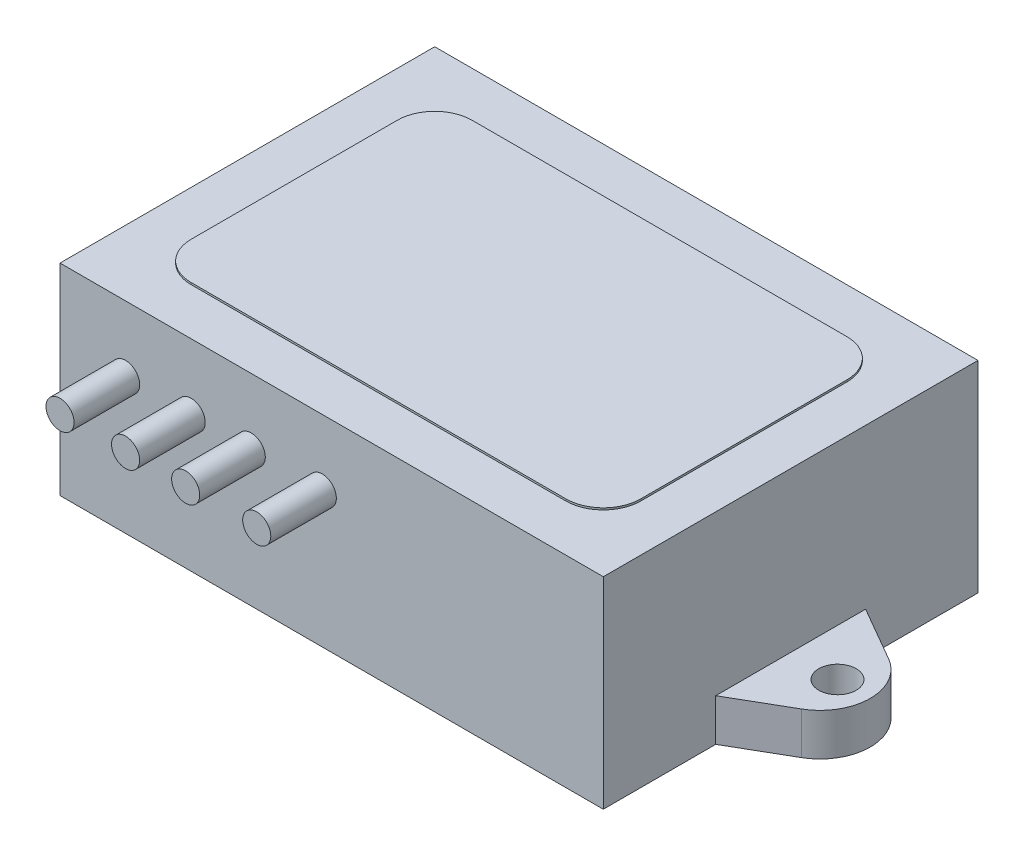
ISO-10303-21;
HEADER;
FILE_DESCRIPTION(('STEP AP214'),'2;1');
FILE_NAME('part.step','',(''),(''),'','','');
FILE_SCHEMA(('AUTOMOTIVE_DESIGN { 1 0 10303 214 1 1 1 1 }'));
ENDSEC;
DATA;
#1=APPLICATION_CONTEXT('core data for automotive mechanical design processes');
#2=APPLICATION_PROTOCOL_DEFINITION('international standard','automotive_design',2000,#1);
#3=PRODUCT_CONTEXT('',#1,'mechanical');
#4=PRODUCT('Part','Part','',(#3));
#5=PRODUCT_RELATED_PRODUCT_CATEGORY('part','',(#4));
#6=PRODUCT_DEFINITION_FORMATION('','',#4);
#7=PRODUCT_DEFINITION_CONTEXT('part definition',#1,'design');
#8=PRODUCT_DEFINITION('design','',#6,#7);
#9=PRODUCT_DEFINITION_SHAPE('','',#8);
#10=(LENGTH_UNIT() NAMED_UNIT(*) SI_UNIT(.MILLI.,.METRE.));
#11=(NAMED_UNIT(*) PLANE_ANGLE_UNIT() SI_UNIT($,.RADIAN.));
#12=(NAMED_UNIT(*) SI_UNIT($,.STERADIAN.) SOLID_ANGLE_UNIT());
#13=UNCERTAINTY_MEASURE_WITH_UNIT(LENGTH_MEASURE(1.E-05),#10,'distance_accuracy_value','');
#14=(GEOMETRIC_REPRESENTATION_CONTEXT(3) GLOBAL_UNCERTAINTY_ASSIGNED_CONTEXT((#13)) GLOBAL_UNIT_ASSIGNED_CONTEXT((#10,
#11,#12)) REPRESENTATION_CONTEXT('',''));
#15=CARTESIAN_POINT('',(0.,0.,0.));
#16=DIRECTION('',(0.,0.,1.));
#17=DIRECTION('',(1.,0.,0.));
#18=AXIS2_PLACEMENT_3D('',#15,#16,#17);
#19=CARTESIAN_POINT('',(0.,21.5,0.));
#20=DIRECTION('',(0.,-1.,0.));
#21=DIRECTION('',(0.,0.,-1.));
#22=AXIS2_PLACEMENT_3D('',#19,#20,#21);
#23=PLANE('',#22);
#24=DIRECTION('',(0.,0.,1.));
#25=VECTOR('',#24,1.);
#26=CARTESIAN_POINT('',(0.,21.5,0.));
#27=LINE('',#26,#25);
#28=CARTESIAN_POINT('',(0.,21.5,-40.));
#29=VERTEX_POINT('',#28);
#30=CARTESIAN_POINT('',(0.,21.5,0.));
#31=VERTEX_POINT('',#30);
#32=EDGE_CURVE('E274',#29,#31,#27,.T.);
#33=ORIENTED_EDGE('',*,*,#32,.T.);
#34=DIRECTION('',(1.,0.,0.));
#35=VECTOR('',#34,1.);
#36=CARTESIAN_POINT('',(0.,21.5,0.));
#37=LINE('',#36,#35);
#38=CARTESIAN_POINT('',(58.,21.5,0.));
#39=VERTEX_POINT('',#38);
#40=EDGE_CURVE('E279',#31,#39,#37,.T.);
#41=ORIENTED_EDGE('',*,*,#40,.T.);
#42=DIRECTION('',(0.,0.,-1.));
#43=VECTOR('',#42,1.);
#44=CARTESIAN_POINT('',(58.,21.5,0.));
#45=LINE('',#44,#43);
#46=CARTESIAN_POINT('',(58.,21.5,-40.));
#47=VERTEX_POINT('',#46);
#48=EDGE_CURVE('E283',#39,#47,#45,.T.);
#49=ORIENTED_EDGE('',*,*,#48,.T.);
#50=DIRECTION('',(-1.,0.,0.));
#51=VECTOR('',#50,1.);
#52=CARTESIAN_POINT('',(0.,21.5,-40.));
#53=LINE('',#52,#51);
#54=EDGE_CURVE('E282',#47,#29,#53,.T.);
#55=ORIENTED_EDGE('',*,*,#54,.T.);
#56=EDGE_LOOP('',(#33,#41,#49,#55));
#57=FACE_BOUND('',#56,.T.);
#58=CARTESIAN_POINT('',(9.,21.5,-9.));
#59=DIRECTION('',(0.,1.,0.));
#60=DIRECTION('',(0.,0.,1.));
#61=AXIS2_PLACEMENT_3D('',#58,#59,#60);
#62=CIRCLE('',#61,4.);
#63=CARTESIAN_POINT('',(5.,21.5,-9.00000000000003));
#64=VERTEX_POINT('',#63);
#65=CARTESIAN_POINT('',(9.00000000000003,21.5,-5.));
#66=VERTEX_POINT('',#65);
#67=EDGE_CURVE('E63',#64,#66,#62,.T.);
#68=ORIENTED_EDGE('',*,*,#67,.F.);
#69=DIRECTION('',(0.,0.,1.));
#70=VECTOR('',#69,1.);
#71=CARTESIAN_POINT('',(5.,21.5,-31.));
#72=LINE('',#71,#70);
#73=CARTESIAN_POINT('',(5.,21.5,-31.));
#74=VERTEX_POINT('',#73);
#75=EDGE_CURVE('E61',#74,#64,#72,.T.);
#76=ORIENTED_EDGE('',*,*,#75,.F.);
#77=CARTESIAN_POINT('',(9.,21.5,-31.));
#78=DIRECTION('',(0.,1.,0.));
#79=DIRECTION('',(0.,0.,-1.));
#80=AXIS2_PLACEMENT_3D('',#77,#78,#79);
#81=CIRCLE('',#80,4.);
#82=CARTESIAN_POINT('',(9.,21.5,-35.));
#83=VERTEX_POINT('',#82);
#84=EDGE_CURVE('E843',#83,#74,#81,.T.);
#85=ORIENTED_EDGE('',*,*,#84,.F.);
#86=DIRECTION('',(-1.,0.,0.));
#87=VECTOR('',#86,1.);
#88=CARTESIAN_POINT('',(49.,21.5,-35.));
#89=LINE('',#88,#87);
#90=CARTESIAN_POINT('',(49.,21.5,-35.));
#91=VERTEX_POINT('',#90);
#92=EDGE_CURVE('E845',#91,#83,#89,.T.);
#93=ORIENTED_EDGE('',*,*,#92,.F.);
#94=CARTESIAN_POINT('',(49.,21.5,-31.));
#95=DIRECTION('',(0.,1.,0.));
#96=DIRECTION('',(0.,0.,1.));
#97=AXIS2_PLACEMENT_3D('',#94,#95,#96);
#98=CIRCLE('',#97,4.);
#99=CARTESIAN_POINT('',(53.,21.5,-31.));
#100=VERTEX_POINT('',#99);
#101=EDGE_CURVE('E838',#100,#91,#98,.T.);
#102=ORIENTED_EDGE('',*,*,#101,.F.);
#103=DIRECTION('',(0.,0.,-1.));
#104=VECTOR('',#103,1.);
#105=CARTESIAN_POINT('',(53.,21.5,-9.00000000000003));
#106=LINE('',#105,#104);
#107=CARTESIAN_POINT('',(53.,21.5,-9.00000000000003));
#108=VERTEX_POINT('',#107);
#109=EDGE_CURVE('E836',#108,#100,#106,.T.);
#110=ORIENTED_EDGE('',*,*,#109,.F.);
#111=CARTESIAN_POINT('',(49.,21.5,-9.));
#112=DIRECTION('',(0.,1.,0.));
#113=DIRECTION('',(0.,0.,1.));
#114=AXIS2_PLACEMENT_3D('',#111,#112,#113);
#115=CIRCLE('',#114,4.);
#116=CARTESIAN_POINT('',(49.,21.5,-5.));
#117=VERTEX_POINT('',#116);
#118=EDGE_CURVE('E832',#117,#108,#115,.T.);
#119=ORIENTED_EDGE('',*,*,#118,.F.);
#120=DIRECTION('',(1.,0.,0.));
#121=VECTOR('',#120,1.);
#122=CARTESIAN_POINT('',(9.00000000000003,21.5,-5.));
#123=LINE('',#122,#121);
#124=EDGE_CURVE('E833',#66,#117,#123,.T.);
#125=ORIENTED_EDGE('',*,*,#124,.F.);
#126=EDGE_LOOP('',(#68,#76,#85,#93,#102,#110,#119,#125));
#127=FACE_BOUND('',#126,.T.);
#128=ADVANCED_FACE('F46',(#57,#127),#23,.F.);
#129=CARTESIAN_POINT('',(0.,21.5,0.));
#130=DIRECTION('',(1.,0.,0.));
#131=DIRECTION('',(0.,0.,-1.));
#132=AXIS2_PLACEMENT_3D('',#129,#130,#131);
#133=PLANE('',#132);
#134=DIRECTION('',(0.,-1.,0.));
#135=VECTOR('',#134,1.);
#136=CARTESIAN_POINT('',(0.,4.5,-28.));
#137=LINE('',#136,#135);
#138=CARTESIAN_POINT('',(0.,4.5,-28.));
#139=VERTEX_POINT('',#138);
#140=CARTESIAN_POINT('',(0.,0.,-28.));
#141=VERTEX_POINT('',#140);
#142=EDGE_CURVE('E231',#139,#141,#137,.T.);
#143=ORIENTED_EDGE('',*,*,#142,.F.);
#144=DIRECTION('',(0.,0.,-1.));
#145=VECTOR('',#144,1.);
#146=CARTESIAN_POINT('',(0.,4.5,-28.));
#147=LINE('',#146,#145);
#148=CARTESIAN_POINT('',(0.,4.5,-12.));
#149=VERTEX_POINT('',#148);
#150=EDGE_CURVE('E230',#149,#139,#147,.T.);
#151=ORIENTED_EDGE('',*,*,#150,.F.);
#152=DIRECTION('',(0.,-1.,0.));
#153=VECTOR('',#152,1.);
#154=CARTESIAN_POINT('',(0.,4.5,-12.));
#155=LINE('',#154,#153);
#156=CARTESIAN_POINT('',(0.,0.,-12.));
#157=VERTEX_POINT('',#156);
#158=EDGE_CURVE('E238',#149,#157,#155,.T.);
#159=ORIENTED_EDGE('',*,*,#158,.T.);
#160=DIRECTION('',(0.,0.,1.));
#161=VECTOR('',#160,1.);
#162=CARTESIAN_POINT('',(0.,0.,0.));
#163=LINE('',#162,#161);
#164=CARTESIAN_POINT('',(0.,0.,0.));
#165=VERTEX_POINT('',#164);
#166=EDGE_CURVE('E250',#157,#165,#163,.T.);
#167=ORIENTED_EDGE('',*,*,#166,.T.);
#168=DIRECTION('',(0.,-1.,0.));
#169=VECTOR('',#168,1.);
#170=CARTESIAN_POINT('',(0.,21.5,0.));
#171=LINE('',#170,#169);
#172=EDGE_CURVE('E305',#31,#165,#171,.T.);
#173=ORIENTED_EDGE('',*,*,#172,.F.);
#174=ORIENTED_EDGE('',*,*,#32,.F.);
#175=DIRECTION('',(0.,-1.,0.));
#176=VECTOR('',#175,1.);
#177=CARTESIAN_POINT('',(0.,21.5,-40.));
#178=LINE('',#177,#176);
#179=CARTESIAN_POINT('',(0.,0.,-40.));
#180=VERTEX_POINT('',#179);
#181=EDGE_CURVE('E281',#29,#180,#178,.T.);
#182=ORIENTED_EDGE('',*,*,#181,.T.);
#183=EDGE_CURVE('E286',#180,#141,#163,.T.);
#184=ORIENTED_EDGE('',*,*,#183,.T.);
#185=EDGE_LOOP('',(#143,#151,#159,#167,#173,#174,#182,#184));
#186=FACE_BOUND('',#185,.T.);
#187=ADVANCED_FACE('F48',(#186),#133,.F.);
#188=CARTESIAN_POINT('',(58.,21.5,0.));
#189=DIRECTION('',(-1.,0.,0.));
#190=DIRECTION('',(0.,0.,1.));
#191=AXIS2_PLACEMENT_3D('',#188,#189,#190);
#192=PLANE('',#191);
#193=DIRECTION('',(0.,-1.,0.));
#194=VECTOR('',#193,1.);
#195=CARTESIAN_POINT('',(58.,4.5,-12.));
#196=LINE('',#195,#194);
#197=CARTESIAN_POINT('',(58.,4.5,-12.));
#198=VERTEX_POINT('',#197);
#199=CARTESIAN_POINT('',(58.,0.,-12.));
#200=VERTEX_POINT('',#199);
#201=EDGE_CURVE('E254',#198,#200,#196,.T.);
#202=ORIENTED_EDGE('',*,*,#201,.F.);
#203=DIRECTION('',(0.,0.,1.));
#204=VECTOR('',#203,1.);
#205=CARTESIAN_POINT('',(58.,4.5,-28.));
#206=LINE('',#205,#204);
#207=CARTESIAN_POINT('',(58.,4.5,-28.));
#208=VERTEX_POINT('',#207);
#209=EDGE_CURVE('E267',#208,#198,#206,.T.);
#210=ORIENTED_EDGE('',*,*,#209,.F.);
#211=DIRECTION('',(0.,-1.,0.));
#212=VECTOR('',#211,1.);
#213=CARTESIAN_POINT('',(58.,4.5,-28.));
#214=LINE('',#213,#212);
#215=CARTESIAN_POINT('',(58.,0.,-28.));
#216=VERTEX_POINT('',#215);
#217=EDGE_CURVE('E252',#208,#216,#214,.T.);
#218=ORIENTED_EDGE('',*,*,#217,.T.);
#219=DIRECTION('',(0.,0.,-1.));
#220=VECTOR('',#219,1.);
#221=CARTESIAN_POINT('',(58.,0.,0.));
#222=LINE('',#221,#220);
#223=CARTESIAN_POINT('',(58.,0.,-40.));
#224=VERTEX_POINT('',#223);
#225=EDGE_CURVE('E292',#216,#224,#222,.T.);
#226=ORIENTED_EDGE('',*,*,#225,.T.);
#227=DIRECTION('',(0.,-1.,0.));
#228=VECTOR('',#227,1.);
#229=CARTESIAN_POINT('',(58.,21.5,-40.));
#230=LINE('',#229,#228);
#231=EDGE_CURVE('E297',#47,#224,#230,.T.);
#232=ORIENTED_EDGE('',*,*,#231,.F.);
#233=ORIENTED_EDGE('',*,*,#48,.F.);
#234=DIRECTION('',(0.,-1.,0.));
#235=VECTOR('',#234,1.);
#236=CARTESIAN_POINT('',(58.,21.5,0.));
#237=LINE('',#236,#235);
#238=CARTESIAN_POINT('',(58.,0.,0.));
#239=VERTEX_POINT('',#238);
#240=EDGE_CURVE('E303',#39,#239,#237,.T.);
#241=ORIENTED_EDGE('',*,*,#240,.T.);
#242=EDGE_CURVE('E295',#239,#200,#222,.T.);
#243=ORIENTED_EDGE('',*,*,#242,.T.);
#244=EDGE_LOOP('',(#202,#210,#218,#226,#232,#233,#241,#243));
#245=FACE_BOUND('',#244,.T.);
#246=ADVANCED_FACE('F317',(#245),#192,.F.);
#247=CARTESIAN_POINT('',(0.,21.5,0.));
#248=DIRECTION('',(0.,0.,-1.));
#249=DIRECTION('',(-1.,0.,0.));
#250=AXIS2_PLACEMENT_3D('',#247,#248,#249);
#251=PLANE('',#250);
#252=CARTESIAN_POINT('',(20.4126967231264,14.5,0.));
#253=DIRECTION('',(0.,0.,-1.));
#254=DIRECTION('',(-1.,0.,0.));
#255=AXIS2_PLACEMENT_3D('',#252,#253,#254);
#256=CIRCLE('',#255,1.5);
#257=CARTESIAN_POINT('',(18.9126967231264,14.5,0.));
#258=VERTEX_POINT('',#257);
#259=EDGE_CURVE('E11',#258,#258,#256,.F.);
#260=ORIENTED_EDGE('',*,*,#259,.F.);
#261=EDGE_LOOP('',(#260));
#262=FACE_BOUND('',#261,.T.);
#263=CARTESIAN_POINT('',(14.,14.5,0.));
#264=DIRECTION('',(0.,0.,-1.));
#265=DIRECTION('',(-1.,0.,0.));
#266=AXIS2_PLACEMENT_3D('',#263,#264,#265);
#267=CIRCLE('',#266,1.5);
#268=CARTESIAN_POINT('',(12.5,14.5,0.));
#269=VERTEX_POINT('',#268);
#270=EDGE_CURVE('E53',#269,#269,#267,.F.);
#271=ORIENTED_EDGE('',*,*,#270,.F.);
#272=EDGE_LOOP('',(#271));
#273=FACE_BOUND('',#272,.T.);
#274=CARTESIAN_POINT('',(28.,14.5,0.));
#275=DIRECTION('',(0.,0.,-1.));
#276=DIRECTION('',(-1.,0.,0.));
#277=AXIS2_PLACEMENT_3D('',#274,#275,#276);
#278=CIRCLE('',#277,1.5);
#279=CARTESIAN_POINT('',(26.5,14.5,0.));
#280=VERTEX_POINT('',#279);
#281=EDGE_CURVE('E306',#280,#280,#278,.F.);
#282=ORIENTED_EDGE('',*,*,#281,.F.);
#283=EDGE_LOOP('',(#282));
#284=FACE_BOUND('',#283,.T.);
#285=CARTESIAN_POINT('',(7.,14.5,0.));
#286=DIRECTION('',(0.,0.,1.));
#287=DIRECTION('',(1.,0.,0.));
#288=AXIS2_PLACEMENT_3D('',#285,#286,#287);
#289=CIRCLE('',#288,1.5);
#290=CARTESIAN_POINT('',(8.5,14.5,0.));
#291=VERTEX_POINT('',#290);
#292=EDGE_CURVE('E307',#291,#291,#289,.T.);
#293=ORIENTED_EDGE('',*,*,#292,.F.);
#294=EDGE_LOOP('',(#293));
#295=FACE_BOUND('',#294,.T.);
#296=DIRECTION('',(1.,0.,0.));
#297=VECTOR('',#296,1.);
#298=CARTESIAN_POINT('',(0.,0.,0.));
#299=LINE('',#298,#297);
#300=EDGE_CURVE('E288',#165,#239,#299,.T.);
#301=ORIENTED_EDGE('',*,*,#300,.T.);
#302=ORIENTED_EDGE('',*,*,#240,.F.);
#303=ORIENTED_EDGE('',*,*,#40,.F.);
#304=ORIENTED_EDGE('',*,*,#172,.T.);
#305=EDGE_LOOP('',(#301,#302,#303,#304));
#306=FACE_BOUND('',#305,.T.);
#307=ADVANCED_FACE('F312',(#262,#273,#284,#295,#306),#251,.F.);
#308=CARTESIAN_POINT('',(0.,21.5,-40.));
#309=DIRECTION('',(0.,0.,1.));
#310=DIRECTION('',(1.,0.,0.));
#311=AXIS2_PLACEMENT_3D('',#308,#309,#310);
#312=PLANE('',#311);
#313=DIRECTION('',(-1.,0.,0.));
#314=VECTOR('',#313,1.);
#315=CARTESIAN_POINT('',(0.,0.,-40.));
#316=LINE('',#315,#314);
#317=EDGE_CURVE('E276',#224,#180,#316,.T.);
#318=ORIENTED_EDGE('',*,*,#317,.T.);
#319=ORIENTED_EDGE('',*,*,#181,.F.);
#320=ORIENTED_EDGE('',*,*,#54,.F.);
#321=ORIENTED_EDGE('',*,*,#231,.T.);
#322=EDGE_LOOP('',(#318,#319,#320,#321));
#323=FACE_BOUND('',#322,.T.);
#324=ADVANCED_FACE('F318',(#323),#312,.F.);
#325=CARTESIAN_POINT('',(0.,0.,0.));
#326=DIRECTION('',(0.,-1.,0.));
#327=DIRECTION('',(0.,0.,-1.));
#328=AXIS2_PLACEMENT_3D('',#325,#326,#327);
#329=PLANE('',#328);
#330=CARTESIAN_POINT('',(-4.99999999999999,0.,-20.));
#331=DIRECTION('',(0.,1.,0.));
#332=DIRECTION('',(0.,0.,1.));
#333=AXIS2_PLACEMENT_3D('',#330,#331,#332);
#334=CIRCLE('',#333,2.);
#335=CARTESIAN_POINT('',(-4.99999999999999,0.,-18.));
#336=VERTEX_POINT('',#335);
#337=EDGE_CURVE('E215',#336,#336,#334,.T.);
#338=ORIENTED_EDGE('',*,*,#337,.T.);
#339=EDGE_LOOP('',(#338));
#340=FACE_BOUND('',#339,.T.);
#341=CARTESIAN_POINT('',(63.,0.,-20.));
#342=DIRECTION('',(0.,1.,0.));
#343=DIRECTION('',(0.,0.,-1.));
#344=AXIS2_PLACEMENT_3D('',#341,#342,#343);
#345=CIRCLE('',#344,2.00000000000001);
#346=CARTESIAN_POINT('',(63.,0.,-22.));
#347=VERTEX_POINT('',#346);
#348=EDGE_CURVE('E201',#347,#347,#345,.T.);
#349=ORIENTED_EDGE('',*,*,#348,.T.);
#350=EDGE_LOOP('',(#349));
#351=FACE_BOUND('',#350,.T.);
#352=ORIENTED_EDGE('',*,*,#183,.F.);
#353=ORIENTED_EDGE('',*,*,#317,.F.);
#354=ORIENTED_EDGE('',*,*,#225,.F.);
#355=DIRECTION('',(-0.866025403784438,0.,-0.5));
#356=VECTOR('',#355,1.);
#357=CARTESIAN_POINT('',(58.,0.,-28.));
#358=LINE('',#357,#356);
#359=CARTESIAN_POINT('',(63.8217967697245,0.,-24.6387840678323));
#360=VERTEX_POINT('',#359);
#361=EDGE_CURVE('E263',#360,#216,#358,.T.);
#362=ORIENTED_EDGE('',*,*,#361,.F.);
#363=CARTESIAN_POINT('',(61.143593539449,0.,-20.));
#364=DIRECTION('',(0.,1.,0.));
#365=DIRECTION('',(0.,0.,1.));
#366=AXIS2_PLACEMENT_3D('',#363,#364,#365);
#367=CIRCLE('',#366,5.35640646055104);
#368=CARTESIAN_POINT('',(63.8217967697245,0.,-15.3612159321677));
#369=VERTEX_POINT('',#368);
#370=EDGE_CURVE('E237',#369,#360,#367,.T.);
#371=ORIENTED_EDGE('',*,*,#370,.F.);
#372=DIRECTION('',(0.866025403784439,0.,-0.499999999999999));
#373=VECTOR('',#372,1.);
#374=CARTESIAN_POINT('',(58.,0.,-12.));
#375=LINE('',#374,#373);
#376=EDGE_CURVE('E261',#200,#369,#375,.T.);
#377=ORIENTED_EDGE('',*,*,#376,.F.);
#378=ORIENTED_EDGE('',*,*,#242,.F.);
#379=ORIENTED_EDGE('',*,*,#300,.F.);
#380=ORIENTED_EDGE('',*,*,#166,.F.);
#381=DIRECTION('',(0.866025403784439,0.,0.499999999999999));
#382=VECTOR('',#381,1.);
#383=CARTESIAN_POINT('',(0.,0.,-12.));
#384=LINE('',#383,#382);
#385=CARTESIAN_POINT('',(-5.82179676972447,0.,-15.3612159321677));
#386=VERTEX_POINT('',#385);
#387=EDGE_CURVE('E223',#386,#157,#384,.T.);
#388=ORIENTED_EDGE('',*,*,#387,.F.);
#389=CARTESIAN_POINT('',(-3.14359353944896,0.,-20.));
#390=DIRECTION('',(0.,1.,0.));
#391=DIRECTION('',(0.,0.,-1.));
#392=AXIS2_PLACEMENT_3D('',#389,#390,#391);
#393=CIRCLE('',#392,5.35640646055104);
#394=CARTESIAN_POINT('',(-5.82179676972447,0.,-24.6387840678323));
#395=VERTEX_POINT('',#394);
#396=EDGE_CURVE('E235',#395,#386,#393,.T.);
#397=ORIENTED_EDGE('',*,*,#396,.F.);
#398=DIRECTION('',(-0.866025403784439,0.,0.499999999999999));
#399=VECTOR('',#398,1.);
#400=CARTESIAN_POINT('',(0.,0.,-28.));
#401=LINE('',#400,#399);
#402=EDGE_CURVE('E232',#141,#395,#401,.T.);
#403=ORIENTED_EDGE('',*,*,#402,.F.);
#404=EDGE_LOOP('',(#352,#353,#354,#362,#371,#377,#378,#379,#380,#388,#397,#403));
#405=FACE_BOUND('',#404,.T.);
#406=ADVANCED_FACE('F337',(#340,#351,#405),#329,.T.);
#407=CARTESIAN_POINT('',(61.143593539449,4.5,-20.));
#408=DIRECTION('',(0.,-1.,0.));
#409=DIRECTION('',(0.,0.,-1.));
#410=AXIS2_PLACEMENT_3D('',#407,#408,#409);
#411=CYLINDRICAL_SURFACE('',#410,5.35640646055104);
#412=ORIENTED_EDGE('',*,*,#370,.T.);
#413=DIRECTION('',(0.,-1.,0.));
#414=VECTOR('',#413,1.);
#415=CARTESIAN_POINT('',(63.8217967697245,4.5,-24.6387840678323));
#416=LINE('',#415,#414);
#417=CARTESIAN_POINT('',(63.8217967697245,4.5,-24.6387840678323));
#418=VERTEX_POINT('',#417);
#419=EDGE_CURVE('E214',#418,#360,#416,.T.);
#420=ORIENTED_EDGE('',*,*,#419,.F.);
#421=CARTESIAN_POINT('',(61.143593539449,4.5,-20.));
#422=DIRECTION('',(0.,1.,0.));
#423=DIRECTION('',(0.,0.,1.));
#424=AXIS2_PLACEMENT_3D('',#421,#422,#423);
#425=CIRCLE('',#424,5.35640646055104);
#426=CARTESIAN_POINT('',(63.8217967697245,4.5,-15.3612159321677));
#427=VERTEX_POINT('',#426);
#428=EDGE_CURVE('E262',#427,#418,#425,.T.);
#429=ORIENTED_EDGE('',*,*,#428,.F.);
#430=DIRECTION('',(0.,-1.,0.));
#431=VECTOR('',#430,1.);
#432=CARTESIAN_POINT('',(63.8217967697245,4.5,-15.3612159321677));
#433=LINE('',#432,#431);
#434=EDGE_CURVE('E260',#427,#369,#433,.T.);
#435=ORIENTED_EDGE('',*,*,#434,.T.);
#436=EDGE_LOOP('',(#412,#420,#429,#435));
#437=FACE_BOUND('',#436,.T.);
#438=ADVANCED_FACE('F347',(#437),#411,.T.);
#439=CARTESIAN_POINT('',(58.,4.5,-28.));
#440=DIRECTION('',(-0.5,0.,0.866025403784438));
#441=DIRECTION('',(0.866025403784438,0.,0.500000000000001));
#442=AXIS2_PLACEMENT_3D('',#439,#440,#441);
#443=PLANE('',#442);
#444=ORIENTED_EDGE('',*,*,#361,.T.);
#445=ORIENTED_EDGE('',*,*,#217,.F.);
#446=DIRECTION('',(-0.866025403784438,0.,-0.5));
#447=VECTOR('',#446,1.);
#448=CARTESIAN_POINT('',(58.,4.5,-28.));
#449=LINE('',#448,#447);
#450=EDGE_CURVE('E271',#418,#208,#449,.T.);
#451=ORIENTED_EDGE('',*,*,#450,.F.);
#452=ORIENTED_EDGE('',*,*,#419,.T.);
#453=EDGE_LOOP('',(#444,#445,#451,#452));
#454=FACE_BOUND('',#453,.T.);
#455=ADVANCED_FACE('F398',(#454),#443,.F.);
#456=CARTESIAN_POINT('',(58.,4.5,-12.));
#457=DIRECTION('',(-0.499999999999999,0.,-0.866025403784439));
#458=DIRECTION('',(-0.866025403784439,0.,0.499999999999999));
#459=AXIS2_PLACEMENT_3D('',#456,#457,#458);
#460=PLANE('',#459);
#461=ORIENTED_EDGE('',*,*,#376,.T.);
#462=ORIENTED_EDGE('',*,*,#434,.F.);
#463=DIRECTION('',(0.866025403784439,0.,-0.499999999999999));
#464=VECTOR('',#463,1.);
#465=CARTESIAN_POINT('',(58.,4.5,-12.));
#466=LINE('',#465,#464);
#467=EDGE_CURVE('E257',#198,#427,#466,.T.);
#468=ORIENTED_EDGE('',*,*,#467,.F.);
#469=ORIENTED_EDGE('',*,*,#201,.T.);
#470=EDGE_LOOP('',(#461,#462,#468,#469));
#471=FACE_BOUND('',#470,.T.);
#472=ADVANCED_FACE('F342',(#471),#460,.F.);
#473=CARTESIAN_POINT('',(61.143593539449,4.5,-20.));
#474=DIRECTION('',(0.,1.,0.));
#475=DIRECTION('',(0.,0.,1.));
#476=AXIS2_PLACEMENT_3D('',#473,#474,#475);
#477=PLANE('',#476);
#478=CARTESIAN_POINT('',(63.,4.5,-20.));
#479=DIRECTION('',(0.,1.,0.));
#480=DIRECTION('',(0.,0.,-1.));
#481=AXIS2_PLACEMENT_3D('',#478,#479,#480);
#482=CIRCLE('',#481,2.00000000000001);
#483=CARTESIAN_POINT('',(63.,4.5,-22.));
#484=VERTEX_POINT('',#483);
#485=EDGE_CURVE('E206',#484,#484,#482,.T.);
#486=ORIENTED_EDGE('',*,*,#485,.F.);
#487=EDGE_LOOP('',(#486));
#488=FACE_BOUND('',#487,.T.);
#489=ORIENTED_EDGE('',*,*,#428,.T.);
#490=ORIENTED_EDGE('',*,*,#450,.T.);
#491=ORIENTED_EDGE('',*,*,#209,.T.);
#492=ORIENTED_EDGE('',*,*,#467,.T.);
#493=EDGE_LOOP('',(#489,#490,#491,#492));
#494=FACE_BOUND('',#493,.T.);
#495=ADVANCED_FACE('F349',(#488,#494),#477,.T.);
#496=CARTESIAN_POINT('',(0.,4.5,-28.));
#497=DIRECTION('',(0.499999999999999,0.,0.866025403784439));
#498=DIRECTION('',(0.866025403784439,0.,-0.499999999999999));
#499=AXIS2_PLACEMENT_3D('',#496,#497,#498);
#500=PLANE('',#499);
#501=ORIENTED_EDGE('',*,*,#402,.T.);
#502=DIRECTION('',(0.,-1.,0.));
#503=VECTOR('',#502,1.);
#504=CARTESIAN_POINT('',(-5.82179676972447,4.5,-24.6387840678323));
#505=LINE('',#504,#503);
#506=CARTESIAN_POINT('',(-5.82179676972447,4.5,-24.6387840678323));
#507=VERTEX_POINT('',#506);
#508=EDGE_CURVE('E248',#507,#395,#505,.T.);
#509=ORIENTED_EDGE('',*,*,#508,.F.);
#510=DIRECTION('',(-0.866025403784439,0.,0.499999999999999));
#511=VECTOR('',#510,1.);
#512=CARTESIAN_POINT('',(0.,4.5,-28.));
#513=LINE('',#512,#511);
#514=EDGE_CURVE('E222',#139,#507,#513,.T.);
#515=ORIENTED_EDGE('',*,*,#514,.F.);
#516=ORIENTED_EDGE('',*,*,#142,.T.);
#517=EDGE_LOOP('',(#501,#509,#515,#516));
#518=FACE_BOUND('',#517,.T.);
#519=ADVANCED_FACE('F417',(#518),#500,.F.);
#520=CARTESIAN_POINT('',(-3.14359353944896,4.5,-20.));
#521=DIRECTION('',(0.,-1.,0.));
#522=DIRECTION('',(0.,0.,-1.));
#523=AXIS2_PLACEMENT_3D('',#520,#521,#522);
#524=CYLINDRICAL_SURFACE('',#523,5.35640646055104);
#525=ORIENTED_EDGE('',*,*,#396,.T.);
#526=DIRECTION('',(0.,-1.,0.));
#527=VECTOR('',#526,1.);
#528=CARTESIAN_POINT('',(-5.82179676972447,4.5,-15.3612159321677));
#529=LINE('',#528,#527);
#530=CARTESIAN_POINT('',(-5.82179676972447,4.5,-15.3612159321677));
#531=VERTEX_POINT('',#530);
#532=EDGE_CURVE('E242',#531,#386,#529,.T.);
#533=ORIENTED_EDGE('',*,*,#532,.F.);
#534=CARTESIAN_POINT('',(-3.14359353944896,4.5,-20.));
#535=DIRECTION('',(0.,1.,0.));
#536=DIRECTION('',(0.,0.,-1.));
#537=AXIS2_PLACEMENT_3D('',#534,#535,#536);
#538=CIRCLE('',#537,5.35640646055104);
#539=EDGE_CURVE('E221',#507,#531,#538,.T.);
#540=ORIENTED_EDGE('',*,*,#539,.F.);
#541=ORIENTED_EDGE('',*,*,#508,.T.);
#542=EDGE_LOOP('',(#525,#533,#540,#541));
#543=FACE_BOUND('',#542,.T.);
#544=ADVANCED_FACE('F424',(#543),#524,.T.);
#545=CARTESIAN_POINT('',(0.,4.5,-12.));
#546=DIRECTION('',(0.499999999999999,0.,-0.866025403784439));
#547=DIRECTION('',(-0.866025403784439,0.,-0.499999999999999));
#548=AXIS2_PLACEMENT_3D('',#545,#546,#547);
#549=PLANE('',#548);
#550=ORIENTED_EDGE('',*,*,#387,.T.);
#551=ORIENTED_EDGE('',*,*,#158,.F.);
#552=DIRECTION('',(0.866025403784439,0.,0.499999999999999));
#553=VECTOR('',#552,1.);
#554=CARTESIAN_POINT('',(0.,4.5,-12.));
#555=LINE('',#554,#553);
#556=EDGE_CURVE('E229',#531,#149,#555,.T.);
#557=ORIENTED_EDGE('',*,*,#556,.F.);
#558=ORIENTED_EDGE('',*,*,#532,.T.);
#559=EDGE_LOOP('',(#550,#551,#557,#558));
#560=FACE_BOUND('',#559,.T.);
#561=ADVANCED_FACE('F435',(#560),#549,.F.);
#562=CARTESIAN_POINT('',(-3.14359353944896,4.5,-20.));
#563=DIRECTION('',(0.,-1.,0.));
#564=DIRECTION('',(0.,0.,-1.));
#565=AXIS2_PLACEMENT_3D('',#562,#563,#564);
#566=PLANE('',#565);
#567=CARTESIAN_POINT('',(-4.99999999999999,4.5,-20.));
#568=DIRECTION('',(0.,1.,0.));
#569=DIRECTION('',(0.,0.,1.));
#570=AXIS2_PLACEMENT_3D('',#567,#568,#569);
#571=CIRCLE('',#570,2.);
#572=CARTESIAN_POINT('',(-4.99999999999999,4.5,-18.));
#573=VERTEX_POINT('',#572);
#574=EDGE_CURVE('E216',#573,#573,#571,.T.);
#575=ORIENTED_EDGE('',*,*,#574,.F.);
#576=EDGE_LOOP('',(#575));
#577=FACE_BOUND('',#576,.T.);
#578=ORIENTED_EDGE('',*,*,#514,.T.);
#579=ORIENTED_EDGE('',*,*,#539,.T.);
#580=ORIENTED_EDGE('',*,*,#556,.T.);
#581=ORIENTED_EDGE('',*,*,#150,.T.);
#582=EDGE_LOOP('',(#578,#579,#580,#581));
#583=FACE_BOUND('',#582,.T.);
#584=ADVANCED_FACE('F439',(#577,#583),#566,.F.);
#585=CARTESIAN_POINT('',(-4.99999999999999,0.,-20.));
#586=DIRECTION('',(0.,1.,0.));
#587=DIRECTION('',(0.,0.,1.));
#588=AXIS2_PLACEMENT_3D('',#585,#586,#587);
#589=CYLINDRICAL_SURFACE('',#588,2.);
#590=ORIENTED_EDGE('',*,*,#337,.F.);
#591=EDGE_LOOP('',(#590));
#592=FACE_BOUND('',#591,.T.);
#593=ORIENTED_EDGE('',*,*,#574,.T.);
#594=EDGE_LOOP('',(#593));
#595=FACE_BOUND('',#594,.T.);
#596=ADVANCED_FACE('F447',(#592,#595),#589,.F.);
#597=CARTESIAN_POINT('',(63.,0.,-20.));
#598=DIRECTION('',(0.,1.,0.));
#599=DIRECTION('',(0.,0.,1.));
#600=AXIS2_PLACEMENT_3D('',#597,#598,#599);
#601=CYLINDRICAL_SURFACE('',#600,2.00000000000001);
#602=ORIENTED_EDGE('',*,*,#348,.F.);
#603=EDGE_LOOP('',(#602));
#604=FACE_BOUND('',#603,.T.);
#605=ORIENTED_EDGE('',*,*,#485,.T.);
#606=EDGE_LOOP('',(#605));
#607=FACE_BOUND('',#606,.T.);
#608=ADVANCED_FACE('F457',(#604,#607),#601,.F.);
#609=CARTESIAN_POINT('',(9.,21.7,-9.));
#610=DIRECTION('',(0.,-1.,0.));
#611=DIRECTION('',(0.,0.,-1.));
#612=AXIS2_PLACEMENT_3D('',#609,#610,#611);
#613=CYLINDRICAL_SURFACE('',#612,4.);
#614=ORIENTED_EDGE('',*,*,#67,.T.);
#615=DIRECTION('',(0.,-1.,0.));
#616=VECTOR('',#615,1.);
#617=CARTESIAN_POINT('',(9.00000000000003,21.7,-5.));
#618=LINE('',#617,#616);
#619=CARTESIAN_POINT('',(9.00000000000003,21.7,-5.));
#620=VERTEX_POINT('',#619);
#621=EDGE_CURVE('E188',#620,#66,#618,.T.);
#622=ORIENTED_EDGE('',*,*,#621,.F.);
#623=CARTESIAN_POINT('',(9.,21.7,-9.));
#624=DIRECTION('',(0.,1.,0.));
#625=DIRECTION('',(0.,0.,1.));
#626=AXIS2_PLACEMENT_3D('',#623,#624,#625);
#627=CIRCLE('',#626,4.);
#628=CARTESIAN_POINT('',(5.,21.7,-9.00000000000003));
#629=VERTEX_POINT('',#628);
#630=EDGE_CURVE('E194',#629,#620,#627,.T.);
#631=ORIENTED_EDGE('',*,*,#630,.F.);
#632=DIRECTION('',(0.,-1.,0.));
#633=VECTOR('',#632,1.);
#634=CARTESIAN_POINT('',(5.,21.7,-9.00000000000003));
#635=LINE('',#634,#633);
#636=EDGE_CURVE('E826',#629,#64,#635,.T.);
#637=ORIENTED_EDGE('',*,*,#636,.T.);
#638=EDGE_LOOP('',(#614,#622,#631,#637));
#639=FACE_BOUND('',#638,.T.);
#640=ADVANCED_FACE('F205',(#639),#613,.T.);
#641=CARTESIAN_POINT('',(9.00000000000003,21.7,-5.));
#642=DIRECTION('',(0.,0.,-1.));
#643=DIRECTION('',(-1.,0.,0.));
#644=AXIS2_PLACEMENT_3D('',#641,#642,#643);
#645=PLANE('',#644);
#646=ORIENTED_EDGE('',*,*,#124,.T.);
#647=DIRECTION('',(0.,-1.,0.));
#648=VECTOR('',#647,1.);
#649=CARTESIAN_POINT('',(49.,21.7,-5.));
#650=LINE('',#649,#648);
#651=CARTESIAN_POINT('',(49.,21.7,-5.));
#652=VERTEX_POINT('',#651);
#653=EDGE_CURVE('E187',#652,#117,#650,.T.);
#654=ORIENTED_EDGE('',*,*,#653,.F.);
#655=DIRECTION('',(1.,0.,0.));
#656=VECTOR('',#655,1.);
#657=CARTESIAN_POINT('',(9.00000000000003,21.7,-5.));
#658=LINE('',#657,#656);
#659=EDGE_CURVE('E182',#620,#652,#658,.T.);
#660=ORIENTED_EDGE('',*,*,#659,.F.);
#661=ORIENTED_EDGE('',*,*,#621,.T.);
#662=EDGE_LOOP('',(#646,#654,#660,#661));
#663=FACE_BOUND('',#662,.T.);
#664=ADVANCED_FACE('F184',(#663),#645,.F.);
#665=CARTESIAN_POINT('',(49.,21.7,-9.));
#666=DIRECTION('',(0.,-1.,0.));
#667=DIRECTION('',(0.,0.,-1.));
#668=AXIS2_PLACEMENT_3D('',#665,#666,#667);
#669=CYLINDRICAL_SURFACE('',#668,4.);
#670=ORIENTED_EDGE('',*,*,#118,.T.);
#671=DIRECTION('',(0.,-1.,0.));
#672=VECTOR('',#671,1.);
#673=CARTESIAN_POINT('',(53.,21.7,-9.00000000000003));
#674=LINE('',#673,#672);
#675=CARTESIAN_POINT('',(53.,21.7,-9.00000000000003));
#676=VERTEX_POINT('',#675);
#677=EDGE_CURVE('E208',#676,#108,#674,.T.);
#678=ORIENTED_EDGE('',*,*,#677,.F.);
#679=CARTESIAN_POINT('',(49.,21.7,-9.));
#680=DIRECTION('',(0.,1.,0.));
#681=DIRECTION('',(0.,0.,1.));
#682=AXIS2_PLACEMENT_3D('',#679,#680,#681);
#683=CIRCLE('',#682,4.);
#684=EDGE_CURVE('E193',#652,#676,#683,.T.);
#685=ORIENTED_EDGE('',*,*,#684,.F.);
#686=ORIENTED_EDGE('',*,*,#653,.T.);
#687=EDGE_LOOP('',(#670,#678,#685,#686));
#688=FACE_BOUND('',#687,.T.);
#689=ADVANCED_FACE('F480',(#688),#669,.T.);
#690=CARTESIAN_POINT('',(53.,21.7,-9.00000000000003));
#691=DIRECTION('',(-1.,0.,0.));
#692=DIRECTION('',(0.,0.,1.));
#693=AXIS2_PLACEMENT_3D('',#690,#691,#692);
#694=PLANE('',#693);
#695=ORIENTED_EDGE('',*,*,#109,.T.);
#696=DIRECTION('',(0.,-1.,0.));
#697=VECTOR('',#696,1.);
#698=CARTESIAN_POINT('',(53.,21.7,-31.));
#699=LINE('',#698,#697);
#700=CARTESIAN_POINT('',(53.,21.7,-31.));
#701=VERTEX_POINT('',#700);
#702=EDGE_CURVE('E856',#701,#100,#699,.T.);
#703=ORIENTED_EDGE('',*,*,#702,.F.);
#704=DIRECTION('',(0.,0.,-1.));
#705=VECTOR('',#704,1.);
#706=CARTESIAN_POINT('',(53.,21.7,-9.00000000000003));
#707=LINE('',#706,#705);
#708=EDGE_CURVE('E819',#676,#701,#707,.T.);
#709=ORIENTED_EDGE('',*,*,#708,.F.);
#710=ORIENTED_EDGE('',*,*,#677,.T.);
#711=EDGE_LOOP('',(#695,#703,#709,#710));
#712=FACE_BOUND('',#711,.T.);
#713=ADVANCED_FACE('F482',(#712),#694,.F.);
#714=CARTESIAN_POINT('',(49.,21.7,-31.));
#715=DIRECTION('',(0.,-1.,0.));
#716=DIRECTION('',(0.,0.,-1.));
#717=AXIS2_PLACEMENT_3D('',#714,#715,#716);
#718=CYLINDRICAL_SURFACE('',#717,4.);
#719=ORIENTED_EDGE('',*,*,#101,.T.);
#720=DIRECTION('',(0.,-1.,0.));
#721=VECTOR('',#720,1.);
#722=CARTESIAN_POINT('',(49.,21.7,-35.));
#723=LINE('',#722,#721);
#724=CARTESIAN_POINT('',(49.,21.7,-35.));
#725=VERTEX_POINT('',#724);
#726=EDGE_CURVE('E851',#725,#91,#723,.T.);
#727=ORIENTED_EDGE('',*,*,#726,.F.);
#728=CARTESIAN_POINT('',(49.,21.7,-31.));
#729=DIRECTION('',(0.,1.,0.));
#730=DIRECTION('',(0.,0.,1.));
#731=AXIS2_PLACEMENT_3D('',#728,#729,#730);
#732=CIRCLE('',#731,4.);
#733=EDGE_CURVE('E825',#701,#725,#732,.T.);
#734=ORIENTED_EDGE('',*,*,#733,.F.);
#735=ORIENTED_EDGE('',*,*,#702,.T.);
#736=EDGE_LOOP('',(#719,#727,#734,#735));
#737=FACE_BOUND('',#736,.T.);
#738=ADVANCED_FACE('F495',(#737),#718,.T.);
#739=CARTESIAN_POINT('',(49.,21.7,-35.));
#740=DIRECTION('',(0.,0.,1.));
#741=DIRECTION('',(1.,0.,0.));
#742=AXIS2_PLACEMENT_3D('',#739,#740,#741);
#743=PLANE('',#742);
#744=ORIENTED_EDGE('',*,*,#92,.T.);
#745=DIRECTION('',(0.,-1.,0.));
#746=VECTOR('',#745,1.);
#747=CARTESIAN_POINT('',(9.,21.7,-35.));
#748=LINE('',#747,#746);
#749=CARTESIAN_POINT('',(9.,21.7,-35.));
#750=VERTEX_POINT('',#749);
#751=EDGE_CURVE('E854',#750,#83,#748,.T.);
#752=ORIENTED_EDGE('',*,*,#751,.F.);
#753=DIRECTION('',(-1.,0.,0.));
#754=VECTOR('',#753,1.);
#755=CARTESIAN_POINT('',(49.,21.7,-35.));
#756=LINE('',#755,#754);
#757=EDGE_CURVE('E823',#725,#750,#756,.T.);
#758=ORIENTED_EDGE('',*,*,#757,.F.);
#759=ORIENTED_EDGE('',*,*,#726,.T.);
#760=EDGE_LOOP('',(#744,#752,#758,#759));
#761=FACE_BOUND('',#760,.T.);
#762=ADVANCED_FACE('F498',(#761),#743,.F.);
#763=CARTESIAN_POINT('',(9.,21.7,-31.));
#764=DIRECTION('',(0.,-1.,0.));
#765=DIRECTION('',(0.,0.,-1.));
#766=AXIS2_PLACEMENT_3D('',#763,#764,#765);
#767=CYLINDRICAL_SURFACE('',#766,4.);
#768=ORIENTED_EDGE('',*,*,#84,.T.);
#769=DIRECTION('',(0.,-1.,0.));
#770=VECTOR('',#769,1.);
#771=CARTESIAN_POINT('',(5.,21.7,-31.));
#772=LINE('',#771,#770);
#773=CARTESIAN_POINT('',(5.,21.7,-31.));
#774=VERTEX_POINT('',#773);
#775=EDGE_CURVE('E850',#774,#74,#772,.T.);
#776=ORIENTED_EDGE('',*,*,#775,.F.);
#777=CARTESIAN_POINT('',(9.,21.7,-31.));
#778=DIRECTION('',(0.,1.,0.));
#779=DIRECTION('',(0.,0.,-1.));
#780=AXIS2_PLACEMENT_3D('',#777,#778,#779);
#781=CIRCLE('',#780,4.);
#782=EDGE_CURVE('E827',#750,#774,#781,.T.);
#783=ORIENTED_EDGE('',*,*,#782,.F.);
#784=ORIENTED_EDGE('',*,*,#751,.T.);
#785=EDGE_LOOP('',(#768,#776,#783,#784));
#786=FACE_BOUND('',#785,.T.);
#787=ADVANCED_FACE('F509',(#786),#767,.T.);
#788=CARTESIAN_POINT('',(5.,21.7,-31.));
#789=DIRECTION('',(1.,0.,0.));
#790=DIRECTION('',(0.,0.,-1.));
#791=AXIS2_PLACEMENT_3D('',#788,#789,#790);
#792=PLANE('',#791);
#793=ORIENTED_EDGE('',*,*,#75,.T.);
#794=ORIENTED_EDGE('',*,*,#636,.F.);
#795=DIRECTION('',(0.,0.,1.));
#796=VECTOR('',#795,1.);
#797=CARTESIAN_POINT('',(5.,21.7,-31.));
#798=LINE('',#797,#796);
#799=EDGE_CURVE('E197',#774,#629,#798,.T.);
#800=ORIENTED_EDGE('',*,*,#799,.F.);
#801=ORIENTED_EDGE('',*,*,#775,.T.);
#802=EDGE_LOOP('',(#793,#794,#800,#801));
#803=FACE_BOUND('',#802,.T.);
#804=ADVANCED_FACE('F518',(#803),#792,.F.);
#805=CARTESIAN_POINT('',(9.,21.7,-9.));
#806=DIRECTION('',(0.,1.,0.));
#807=DIRECTION('',(0.,0.,1.));
#808=AXIS2_PLACEMENT_3D('',#805,#806,#807);
#809=PLANE('',#808);
#810=ORIENTED_EDGE('',*,*,#630,.T.);
#811=ORIENTED_EDGE('',*,*,#659,.T.);
#812=ORIENTED_EDGE('',*,*,#684,.T.);
#813=ORIENTED_EDGE('',*,*,#708,.T.);
#814=ORIENTED_EDGE('',*,*,#733,.T.);
#815=ORIENTED_EDGE('',*,*,#757,.T.);
#816=ORIENTED_EDGE('',*,*,#782,.T.);
#817=ORIENTED_EDGE('',*,*,#799,.T.);
#818=EDGE_LOOP('',(#810,#811,#812,#813,#814,#815,#816,#817));
#819=FACE_BOUND('',#818,.T.);
#820=ADVANCED_FACE('F191',(#819),#809,.T.);
#821=CARTESIAN_POINT('',(7.,14.5,7.));
#822=DIRECTION('',(0.,0.,-1.));
#823=DIRECTION('',(-1.,0.,0.));
#824=AXIS2_PLACEMENT_3D('',#821,#822,#823);
#825=CYLINDRICAL_SURFACE('',#824,1.5);
#826=CARTESIAN_POINT('',(7.,14.5,7.));
#827=DIRECTION('',(0.,0.,1.));
#828=DIRECTION('',(1.,0.,0.));
#829=AXIS2_PLACEMENT_3D('',#826,#827,#828);
#830=CIRCLE('',#829,1.5);
#831=CARTESIAN_POINT('',(8.5,14.5,7.));
#832=VERTEX_POINT('',#831);
#833=EDGE_CURVE('E812',#832,#832,#830,.T.);
#834=ORIENTED_EDGE('',*,*,#833,.F.);
#835=EDGE_LOOP('',(#834));
#836=FACE_BOUND('',#835,.T.);
#837=ORIENTED_EDGE('',*,*,#292,.T.);
#838=EDGE_LOOP('',(#837));
#839=FACE_BOUND('',#838,.T.);
#840=ADVANCED_FACE('F533',(#836,#839),#825,.T.);
#841=CARTESIAN_POINT('',(7.,14.5,7.));
#842=DIRECTION('',(0.,0.,1.));
#843=DIRECTION('',(1.,0.,0.));
#844=AXIS2_PLACEMENT_3D('',#841,#842,#843);
#845=PLANE('',#844);
#846=ORIENTED_EDGE('',*,*,#833,.T.);
#847=EDGE_LOOP('',(#846));
#848=FACE_BOUND('',#847,.T.);
#849=ADVANCED_FACE('F538',(#848),#845,.T.);
#850=CARTESIAN_POINT('',(28.,14.5,7.));
#851=DIRECTION('',(0.,0.,-1.));
#852=DIRECTION('',(-1.,0.,0.));
#853=AXIS2_PLACEMENT_3D('',#850,#851,#852);
#854=CYLINDRICAL_SURFACE('',#853,1.5);
#855=CARTESIAN_POINT('',(28.,14.5,7.));
#856=DIRECTION('',(0.,0.,1.));
#857=DIRECTION('',(1.,0.,0.));
#858=AXIS2_PLACEMENT_3D('',#855,#856,#857);
#859=CIRCLE('',#858,1.5);
#860=CARTESIAN_POINT('',(29.5,14.5,7.));
#861=VERTEX_POINT('',#860);
#862=EDGE_CURVE('E810',#861,#861,#859,.T.);
#863=ORIENTED_EDGE('',*,*,#862,.F.);
#864=EDGE_LOOP('',(#863));
#865=FACE_BOUND('',#864,.T.);
#866=ORIENTED_EDGE('',*,*,#281,.T.);
#867=EDGE_LOOP('',(#866));
#868=FACE_BOUND('',#867,.T.);
#869=ADVANCED_FACE('F546',(#865,#868),#854,.T.);
#870=CARTESIAN_POINT('',(28.,14.5,7.));
#871=DIRECTION('',(0.,0.,1.));
#872=DIRECTION('',(1.,0.,0.));
#873=AXIS2_PLACEMENT_3D('',#870,#871,#872);
#874=PLANE('',#873);
#875=ORIENTED_EDGE('',*,*,#862,.T.);
#876=EDGE_LOOP('',(#875));
#877=FACE_BOUND('',#876,.T.);
#878=ADVANCED_FACE('F551',(#877),#874,.T.);
#879=CARTESIAN_POINT('',(14.,14.5,7.));
#880=DIRECTION('',(0.,0.,-1.));
#881=DIRECTION('',(-1.,0.,0.));
#882=AXIS2_PLACEMENT_3D('',#879,#880,#881);
#883=CYLINDRICAL_SURFACE('',#882,1.5);
#884=CARTESIAN_POINT('',(14.,14.5,7.));
#885=DIRECTION('',(0.,0.,1.));
#886=DIRECTION('',(1.,0.,0.));
#887=AXIS2_PLACEMENT_3D('',#884,#885,#886);
#888=CIRCLE('',#887,1.5);
#889=CARTESIAN_POINT('',(15.5,14.5,7.));
#890=VERTEX_POINT('',#889);
#891=EDGE_CURVE('E807',#890,#890,#888,.T.);
#892=ORIENTED_EDGE('',*,*,#891,.F.);
#893=EDGE_LOOP('',(#892));
#894=FACE_BOUND('',#893,.T.);
#895=ORIENTED_EDGE('',*,*,#270,.T.);
#896=EDGE_LOOP('',(#895));
#897=FACE_BOUND('',#896,.T.);
#898=ADVANCED_FACE('F311',(#894,#897),#883,.T.);
#899=CARTESIAN_POINT('',(14.,14.5,7.));
#900=DIRECTION('',(0.,0.,1.));
#901=DIRECTION('',(1.,0.,0.));
#902=AXIS2_PLACEMENT_3D('',#899,#900,#901);
#903=PLANE('',#902);
#904=ORIENTED_EDGE('',*,*,#891,.T.);
#905=EDGE_LOOP('',(#904));
#906=FACE_BOUND('',#905,.T.);
#907=ADVANCED_FACE('F569',(#906),#903,.T.);
#908=CARTESIAN_POINT('',(20.4126967231264,14.5,7.));
#909=DIRECTION('',(0.,0.,-1.));
#910=DIRECTION('',(-1.,0.,0.));
#911=AXIS2_PLACEMENT_3D('',#908,#909,#910);
#912=CYLINDRICAL_SURFACE('',#911,1.5);
#913=CARTESIAN_POINT('',(20.4126967231264,14.5,7.));
#914=DIRECTION('',(0.,0.,1.));
#915=DIRECTION('',(1.,0.,0.));
#916=AXIS2_PLACEMENT_3D('',#913,#914,#915);
#917=CIRCLE('',#916,1.5);
#918=CARTESIAN_POINT('',(21.9126967231264,14.5,7.));
#919=VERTEX_POINT('',#918);
#920=EDGE_CURVE('E808',#919,#919,#917,.T.);
#921=ORIENTED_EDGE('',*,*,#920,.F.);
#922=EDGE_LOOP('',(#921));
#923=FACE_BOUND('',#922,.T.);
#924=ORIENTED_EDGE('',*,*,#259,.T.);
#925=EDGE_LOOP('',(#924));
#926=FACE_BOUND('',#925,.T.);
#927=ADVANCED_FACE('F579',(#923,#926),#912,.T.);
#928=CARTESIAN_POINT('',(20.4126967231264,14.5,7.));
#929=DIRECTION('',(0.,0.,1.));
#930=DIRECTION('',(1.,0.,0.));
#931=AXIS2_PLACEMENT_3D('',#928,#929,#930);
#932=PLANE('',#931);
#933=ORIENTED_EDGE('',*,*,#920,.T.);
#934=EDGE_LOOP('',(#933));
#935=FACE_BOUND('',#934,.T.);
#936=ADVANCED_FACE('F584',(#935),#932,.T.);
#937=CLOSED_SHELL('',(#128,#187,#246,#307,#324,#406,#438,#455,#472,#495,#519,#544,#561,#584,
#596,#608,#640,#664,#689,#713,#738,#762,#787,#804,#820,#840,#849,#869,#878,#898,#907,#927,#936));
#938=MANIFOLD_SOLID_BREP('B2',#937);
#939=ADVANCED_BREP_SHAPE_REPRESENTATION('',(#18,#938),#14);
#940=SHAPE_DEFINITION_REPRESENTATION(#9,#939);
ENDSEC;
END-ISO-10303-21;
